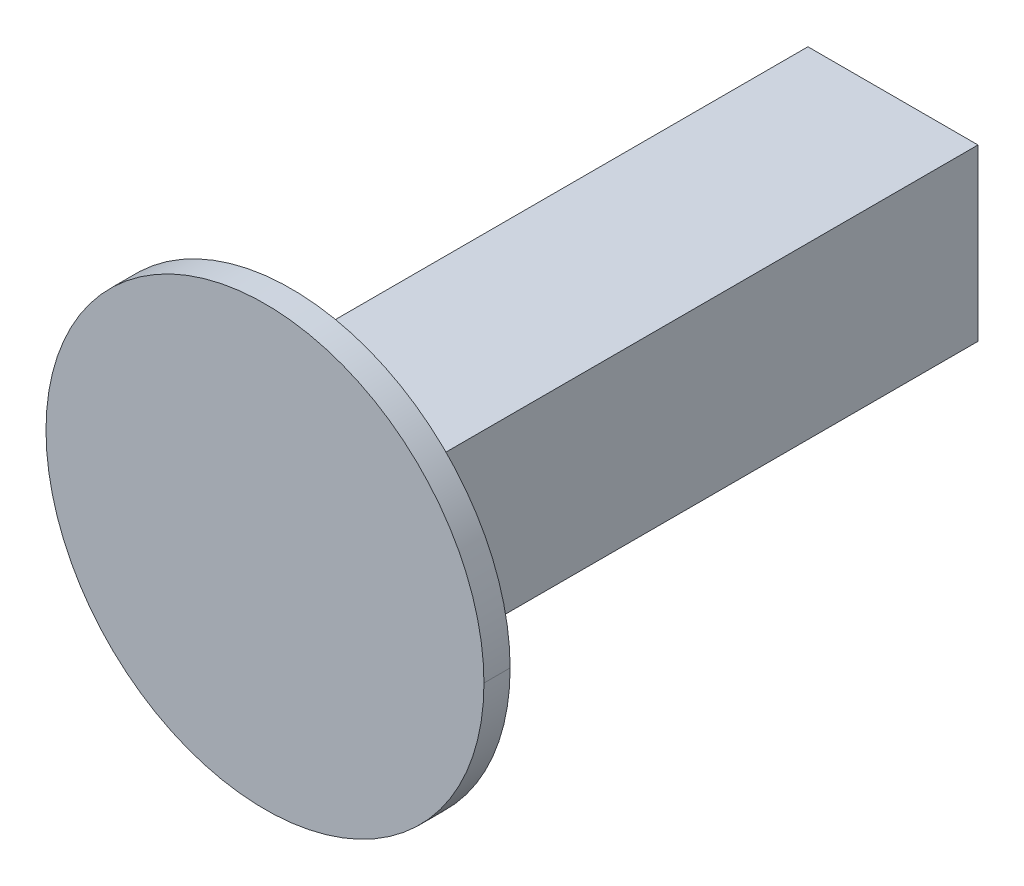
ISO-10303-21;
HEADER;
FILE_DESCRIPTION(('STEP AP214'),'2;1');
FILE_NAME('part.step','',(''),(''),'','','');
FILE_SCHEMA(('AUTOMOTIVE_DESIGN { 1 0 10303 214 1 1 1 1 }'));
ENDSEC;
DATA;
#1=APPLICATION_CONTEXT('core data for automotive mechanical design processes');
#2=APPLICATION_PROTOCOL_DEFINITION('international standard','automotive_design',2000,#1);
#3=PRODUCT_CONTEXT('',#1,'mechanical');
#4=PRODUCT('Part','Part','',(#3));
#5=PRODUCT_RELATED_PRODUCT_CATEGORY('part','',(#4));
#6=PRODUCT_DEFINITION_FORMATION('','',#4);
#7=PRODUCT_DEFINITION_CONTEXT('part definition',#1,'design');
#8=PRODUCT_DEFINITION('design','',#6,#7);
#9=PRODUCT_DEFINITION_SHAPE('','',#8);
#10=(LENGTH_UNIT() NAMED_UNIT(*) SI_UNIT(.MILLI.,.METRE.));
#11=(NAMED_UNIT(*) PLANE_ANGLE_UNIT() SI_UNIT($,.RADIAN.));
#12=(NAMED_UNIT(*) SI_UNIT($,.STERADIAN.) SOLID_ANGLE_UNIT());
#13=UNCERTAINTY_MEASURE_WITH_UNIT(LENGTH_MEASURE(1.E-05),#10,'distance_accuracy_value','');
#14=(GEOMETRIC_REPRESENTATION_CONTEXT(3) GLOBAL_UNCERTAINTY_ASSIGNED_CONTEXT((#13)) GLOBAL_UNIT_ASSIGNED_CONTEXT((#10,
#11,#12)) REPRESENTATION_CONTEXT('',''));
#15=CARTESIAN_POINT('',(0.,0.,0.));
#16=DIRECTION('',(0.,0.,1.));
#17=DIRECTION('',(1.,0.,0.));
#18=AXIS2_PLACEMENT_3D('',#15,#16,#17);
#19=CARTESIAN_POINT('',(3.63240747260726,-15.8073131525604,15.7803044688322));
#20=DIRECTION('',(-0.707106826087826,0.,-0.707106736285266));
#21=DIRECTION('',(-0.707106736285266,0.,0.707106826087826));
#22=AXIS2_PLACEMENT_3D('',#19,#20,#21);
#23=PLANE('',#22);
#24=DIRECTION('',(0.577350226437847,0.577350290565514,-0.577350290565514));
#25=VECTOR('',#24,1.);
#26=CARTESIAN_POINT('',(3.43240749160725,-15.8034131584001,15.9803044732719));
#27=LINE('',#26,#25);
#28=CARTESIAN_POINT('',(3.43240749136221,-15.8034131584566,15.9803044752322));
#29=VERTEX_POINT('',#28);
#30=CARTESIAN_POINT('',(3.63240747260726,-15.6034131551855,15.7803044694448));
#31=VERTEX_POINT('',#30);
#32=EDGE_CURVE('E28',#29,#31,#27,.T.);
#33=ORIENTED_EDGE('',*,*,#32,.F.);
#34=DIRECTION('',(0.,1.,0.));
#35=VECTOR('',#34,1.);
#36=CARTESIAN_POINT('',(3.43240749160725,-15.8034131603604,15.9803044752322));
#37=LINE('',#36,#35);
#38=CARTESIAN_POINT('',(3.432407491579,-15.153413168146,15.9803044749872));
#39=VERTEX_POINT('',#38);
#40=EDGE_CURVE('E11',#29,#39,#37,.T.);
#41=ORIENTED_EDGE('',*,*,#40,.T.);
#42=DIRECTION('',(-0.577350226437845,0.577350290565517,0.577350290565512));
#43=VECTOR('',#42,1.);
#44=CARTESIAN_POINT('',(3.63240747260726,-15.3534131701352,15.7803044700574));
#45=LINE('',#44,#43);
#46=CARTESIAN_POINT('',(3.63240747291355,-15.3534131695226,15.7803044688322));
#47=VERTEX_POINT('',#46);
#48=EDGE_CURVE('E161',#47,#39,#45,.T.);
#49=ORIENTED_EDGE('',*,*,#48,.F.);
#50=DIRECTION('',(0.,1.,0.));
#51=VECTOR('',#50,1.);
#52=CARTESIAN_POINT('',(3.63240747260726,-15.6034131539604,15.7803044688322));
#53=LINE('',#52,#51);
#54=EDGE_CURVE('E129',#31,#47,#53,.T.);
#55=ORIENTED_EDGE('',*,*,#54,.F.);
#56=EDGE_LOOP('',(#33,#41,#49,#55));
#57=FACE_BOUND('',#56,.T.);
#58=ADVANCED_FACE('F17',(#57),#23,.T.);
#59=CARTESIAN_POINT('',(3.43240749160725,-15.8034131603604,18.2803044726322));
#60=DIRECTION('',(1.,0.,0.));
#61=DIRECTION('',(0.,1.,0.));
#62=AXIS2_PLACEMENT_3D('',#59,#60,#61);
#63=PLANE('',#62);
#64=DIRECTION('',(0.,0.,1.));
#65=VECTOR('',#64,1.);
#66=CARTESIAN_POINT('',(3.43240749160725,-15.8034131603604,18.2803044726322));
#67=LINE('',#66,#65);
#68=CARTESIAN_POINT('',(3.43240749155074,-15.80341316053,18.2803044726322));
#69=VERTEX_POINT('',#68);
#70=EDGE_CURVE('E95',#29,#69,#67,.T.);
#71=ORIENTED_EDGE('',*,*,#70,.T.);
#72=DIRECTION('',(0.,-1.,0.));
#73=VECTOR('',#72,1.);
#74=CARTESIAN_POINT('',(3.43240749160725,-15.8034131603604,18.2803044726322));
#75=LINE('',#74,#73);
#76=CARTESIAN_POINT('',(3.43240749143771,-15.1534131657145,18.2803044726322));
#77=VERTEX_POINT('',#76);
#78=EDGE_CURVE('E215',#77,#69,#75,.T.);
#79=ORIENTED_EDGE('',*,*,#78,.F.);
#80=DIRECTION('',(0.,0.,-1.));
#81=VECTOR('',#80,1.);
#82=CARTESIAN_POINT('',(3.43240749138119,-15.1534131649604,15.9803044752322));
#83=LINE('',#82,#81);
#84=EDGE_CURVE('E125',#77,#39,#83,.T.);
#85=ORIENTED_EDGE('',*,*,#84,.T.);
#86=ORIENTED_EDGE('',*,*,#40,.F.);
#87=EDGE_LOOP('',(#71,#79,#85,#86));
#88=FACE_BOUND('',#87,.T.);
#89=ADVANCED_FACE('F123',(#88),#63,.F.);
#90=CARTESIAN_POINT('',(4.08630747920726,-15.6034131539604,15.7803044688322));
#91=DIRECTION('',(0.,-0.707106781186548,-0.707106781186548));
#92=DIRECTION('',(0.,-0.707106781186548,0.707106781186548));
#93=AXIS2_PLACEMENT_3D('',#90,#91,#92);
#94=PLANE('',#93);
#95=DIRECTION('',(-0.577350267982151,0.577350271604574,-0.577350267982153));
#96=VECTOR('',#95,1.);
#97=CARTESIAN_POINT('',(4.08240748500925,-15.8034131603604,15.9803044732342));
#98=LINE('',#97,#96);
#99=CARTESIAN_POINT('',(4.08240748487253,-15.8034131603604,15.9803044749825));
#100=VERTEX_POINT('',#99);
#101=CARTESIAN_POINT('',(3.8824074799193,-15.603413154573,15.780304469259));
#102=VERTEX_POINT('',#101);
#103=EDGE_CURVE('E135',#100,#102,#98,.T.);
#104=ORIENTED_EDGE('',*,*,#103,.F.);
#105=DIRECTION('',(-1.,0.,0.));
#106=VECTOR('',#105,1.);
#107=CARTESIAN_POINT('',(4.08240748700726,-15.8034131603604,15.9803044752322));
#108=LINE('',#107,#106);
#109=EDGE_CURVE('E77',#100,#29,#108,.T.);
#110=ORIENTED_EDGE('',*,*,#109,.T.);
#111=ORIENTED_EDGE('',*,*,#32,.T.);
#112=DIRECTION('',(-1.,0.,0.));
#113=VECTOR('',#112,1.);
#114=CARTESIAN_POINT('',(3.88240748060726,-15.6034131539604,15.7803044688322));
#115=LINE('',#114,#113);
#116=EDGE_CURVE('E159',#102,#31,#115,.T.);
#117=ORIENTED_EDGE('',*,*,#116,.F.);
#118=EDGE_LOOP('',(#104,#110,#111,#117));
#119=FACE_BOUND('',#118,.T.);
#120=ADVANCED_FACE('F133',(#119),#94,.T.);
#121=CARTESIAN_POINT('',(3.88240748060726,-15.6034131539604,15.7803044688322));
#122=DIRECTION('',(0.,0.,-1.));
#123=DIRECTION('',(0.,-1.,0.));
#124=AXIS2_PLACEMENT_3D('',#121,#122,#123);
#125=PLANE('',#124);
#126=ORIENTED_EDGE('',*,*,#116,.T.);
#127=ORIENTED_EDGE('',*,*,#54,.T.);
#128=DIRECTION('',(-1.,0.,0.));
#129=VECTOR('',#128,1.);
#130=CARTESIAN_POINT('',(4.08630747920726,-15.3534131713604,15.7803044688322));
#131=LINE('',#130,#129);
#132=CARTESIAN_POINT('',(3.88240747930672,-15.3534131701352,15.7803044686465));
#133=VERTEX_POINT('',#132);
#134=EDGE_CURVE('E62',#133,#47,#131,.T.);
#135=ORIENTED_EDGE('',*,*,#134,.F.);
#136=DIRECTION('',(0.,1.,0.));
#137=VECTOR('',#136,1.);
#138=CARTESIAN_POINT('',(3.88240747986409,-15.8073131525604,15.780304468089));
#139=LINE('',#138,#137);
#140=EDGE_CURVE('E164',#102,#133,#139,.T.);
#141=ORIENTED_EDGE('',*,*,#140,.F.);
#142=EDGE_LOOP('',(#126,#127,#135,#141));
#143=FACE_BOUND('',#142,.T.);
#144=ADVANCED_FACE('F238',(#143),#125,.T.);
#145=CARTESIAN_POINT('',(4.08630747920726,-15.1534131649604,15.9803044752322));
#146=DIRECTION('',(0.,0.707106781186547,-0.707106781186548));
#147=DIRECTION('',(-1.,0.,0.));
#148=AXIS2_PLACEMENT_3D('',#145,#146,#147);
#149=PLANE('',#148);
#150=DIRECTION('',(0.577350267982151,0.577350271604574,0.577350267982153));
#151=VECTOR('',#150,1.);
#152=CARTESIAN_POINT('',(3.88240747986409,-15.3534131713604,15.780304468089));
#153=LINE('',#152,#151);
#154=CARTESIAN_POINT('',(4.08240748278032,-15.1534131658841,15.9803044740023));
#155=VERTEX_POINT('',#154);
#156=EDGE_CURVE('E165',#133,#155,#153,.T.);
#157=ORIENTED_EDGE('',*,*,#156,.F.);
#158=ORIENTED_EDGE('',*,*,#134,.T.);
#159=ORIENTED_EDGE('',*,*,#48,.T.);
#160=DIRECTION('',(1.,0.,0.));
#161=VECTOR('',#160,1.);
#162=CARTESIAN_POINT('',(4.08240748700726,-15.1534131649604,15.9803044752322));
#163=LINE('',#162,#161);
#164=EDGE_CURVE('E21',#39,#155,#163,.T.);
#165=ORIENTED_EDGE('',*,*,#164,.T.);
#166=EDGE_LOOP('',(#157,#158,#159,#165));
#167=FACE_BOUND('',#166,.T.);
#168=ADVANCED_FACE('F19',(#167),#149,.T.);
#169=CARTESIAN_POINT('',(4.08240748700726,-15.8034131603604,18.2803044726322));
#170=DIRECTION('',(0.,1.,0.));
#171=DIRECTION('',(1.,0.,0.));
#172=AXIS2_PLACEMENT_3D('',#169,#170,#171);
#173=PLANE('',#172);
#174=DIRECTION('',(0.,0.,1.));
#175=VECTOR('',#174,1.);
#176=CARTESIAN_POINT('',(4.08240748700726,-15.8034131603604,15.9803044752322));
#177=LINE('',#176,#175);
#178=CARTESIAN_POINT('',(4.08240748734635,-15.803413160417,18.2803044726322));
#179=VERTEX_POINT('',#178);
#180=EDGE_CURVE('E154',#100,#179,#177,.T.);
#181=ORIENTED_EDGE('',*,*,#180,.T.);
#182=DIRECTION('',(1.,0.,0.));
#183=VECTOR('',#182,1.);
#184=CARTESIAN_POINT('',(4.08240748700726,-15.8034131603604,18.2803044726322));
#185=LINE('',#184,#183);
#186=EDGE_CURVE('E142',#69,#179,#185,.T.);
#187=ORIENTED_EDGE('',*,*,#186,.F.);
#188=ORIENTED_EDGE('',*,*,#70,.F.);
#189=ORIENTED_EDGE('',*,*,#109,.F.);
#190=EDGE_LOOP('',(#181,#187,#188,#189));
#191=FACE_BOUND('',#190,.T.);
#192=ADVANCED_FACE('F140',(#191),#173,.F.);
#193=CARTESIAN_POINT('',(4.08240748700726,-15.1534131649604,15.9803044752322));
#194=DIRECTION('',(0.,-1.,0.));
#195=DIRECTION('',(0.,0.,-1.));
#196=AXIS2_PLACEMENT_3D('',#193,#194,#195);
#197=PLANE('',#196);
#198=ORIENTED_EDGE('',*,*,#84,.F.);
#199=DIRECTION('',(-1.,0.,0.));
#200=VECTOR('',#199,1.);
#201=CARTESIAN_POINT('',(4.08240748700726,-15.1534131649604,18.2803044726322));
#202=LINE('',#201,#200);
#203=CARTESIAN_POINT('',(4.08240748512228,-15.1534131647344,18.2803044726322));
#204=VERTEX_POINT('',#203);
#205=EDGE_CURVE('E212',#204,#77,#202,.T.);
#206=ORIENTED_EDGE('',*,*,#205,.F.);
#207=DIRECTION('',(0.,0.,-1.));
#208=VECTOR('',#207,1.);
#209=CARTESIAN_POINT('',(4.08240748700726,-15.1534131645083,15.9803044752322));
#210=LINE('',#209,#208);
#211=EDGE_CURVE('E157',#204,#155,#210,.T.);
#212=ORIENTED_EDGE('',*,*,#211,.T.);
#213=ORIENTED_EDGE('',*,*,#164,.F.);
#214=EDGE_LOOP('',(#198,#206,#212,#213));
#215=FACE_BOUND('',#214,.T.);
#216=ADVANCED_FACE('F235',(#215),#197,.F.);
#217=CARTESIAN_POINT('',(4.08240748700726,-15.8073131525604,15.9803044752322));
#218=DIRECTION('',(0.707106781186546,0.,-0.707106781186549));
#219=DIRECTION('',(0.,-1.,0.));
#220=AXIS2_PLACEMENT_3D('',#217,#218,#219);
#221=PLANE('',#220);
#222=ORIENTED_EDGE('',*,*,#156,.T.);
#223=DIRECTION('',(0.,-1.,0.));
#224=VECTOR('',#223,1.);
#225=CARTESIAN_POINT('',(4.08240748700726,-15.8034131603604,15.9803044752322));
#226=LINE('',#225,#224);
#227=EDGE_CURVE('E156',#155,#100,#226,.T.);
#228=ORIENTED_EDGE('',*,*,#227,.T.);
#229=ORIENTED_EDGE('',*,*,#103,.T.);
#230=ORIENTED_EDGE('',*,*,#140,.T.);
#231=EDGE_LOOP('',(#222,#228,#229,#230));
#232=FACE_BOUND('',#231,.T.);
#233=ADVANCED_FACE('F257',(#232),#221,.T.);
#234=CARTESIAN_POINT('',(4.08240748700726,-15.8034131603604,15.9803044752322));
#235=DIRECTION('',(-1.,0.,0.));
#236=DIRECTION('',(0.,0.,1.));
#237=AXIS2_PLACEMENT_3D('',#234,#235,#236);
#238=PLANE('',#237);
#239=ORIENTED_EDGE('',*,*,#211,.F.);
#240=DIRECTION('',(0.,1.,0.));
#241=VECTOR('',#240,1.);
#242=CARTESIAN_POINT('',(4.08240748745938,-16.3253431807604,18.2803044726322));
#243=LINE('',#242,#241);
#244=EDGE_CURVE('E152',#179,#204,#243,.T.);
#245=ORIENTED_EDGE('',*,*,#244,.F.);
#246=ORIENTED_EDGE('',*,*,#180,.F.);
#247=ORIENTED_EDGE('',*,*,#227,.F.);
#248=EDGE_LOOP('',(#239,#245,#246,#247));
#249=FACE_BOUND('',#248,.T.);
#250=ADVANCED_FACE('F254',(#249),#238,.F.);
#251=CARTESIAN_POINT('',(4.60433750740725,-16.3253431807604,18.2803044726322));
#252=DIRECTION('',(0.,0.,-1.));
#253=DIRECTION('',(0.,-1.,0.));
#254=AXIS2_PLACEMENT_3D('',#251,#252,#253);
#255=PLANE('',#254);
#256=ORIENTED_EDGE('',*,*,#186,.T.);
#257=ORIENTED_EDGE('',*,*,#244,.T.);
#258=ORIENTED_EDGE('',*,*,#205,.T.);
#259=ORIENTED_EDGE('',*,*,#78,.T.);
#260=EDGE_LOOP('',(#256,#257,#258,#259));
#261=FACE_BOUND('',#260,.T.);
#262=CARTESIAN_POINT('',(3.75740747660726,-15.4784131753604,18.2803044726322));
#263=DIRECTION('',(0.,0.,1.));
#264=DIRECTION('',(1.,0.,0.));
#265=AXIS2_PLACEMENT_3D('',#262,#263,#264);
#266=CIRCLE('',#265,0.836887378800002);
#267=CARTESIAN_POINT('',(4.59429485540726,-15.4784131753604,18.2803044726322));
#268=VERTEX_POINT('',#267);
#269=CARTESIAN_POINT('',(2.92052009780725,-15.4784131753604,18.2803044726322));
#270=VERTEX_POINT('',#269);
#271=EDGE_CURVE('E198',#268,#270,#266,.T.);
#272=ORIENTED_EDGE('',*,*,#271,.F.);
#273=CARTESIAN_POINT('',(3.75740747660726,-15.4784131753604,18.2803044726322));
#274=DIRECTION('',(0.,0.,1.));
#275=DIRECTION('',(1.,0.,0.));
#276=AXIS2_PLACEMENT_3D('',#273,#274,#275);
#277=CIRCLE('',#276,0.836887378800002);
#278=EDGE_CURVE('E209',#270,#268,#277,.T.);
#279=ORIENTED_EDGE('',*,*,#278,.F.);
#280=EDGE_LOOP('',(#272,#279));
#281=FACE_BOUND('',#280,.T.);
#282=ADVANCED_FACE('F227',(#261,#281),#255,.T.);
#283=CARTESIAN_POINT('',(3.75740747660726,-15.4784131753604,18.2803044726322));
#284=DIRECTION('',(0.,0.,1.));
#285=DIRECTION('',(1.,0.,0.));
#286=AXIS2_PLACEMENT_3D('',#283,#284,#285);
#287=CYLINDRICAL_SURFACE('',#286,0.836887378800002);
#288=DIRECTION('',(0.,0.,1.));
#289=VECTOR('',#288,1.);
#290=CARTESIAN_POINT('',(2.92052009780725,-15.4784131753604,18.2803044726322));
#291=LINE('',#290,#289);
#292=CARTESIAN_POINT('',(2.92052009780725,-15.4784131753604,18.3803044758322));
#293=VERTEX_POINT('',#292);
#294=EDGE_CURVE('E189',#270,#293,#291,.T.);
#295=ORIENTED_EDGE('',*,*,#294,.F.);
#296=ORIENTED_EDGE('',*,*,#278,.T.);
#297=DIRECTION('',(0.,0.,1.));
#298=VECTOR('',#297,1.);
#299=CARTESIAN_POINT('',(4.59429485540726,-15.4784131753604,18.2803044726322));
#300=LINE('',#299,#298);
#301=CARTESIAN_POINT('',(4.59429485540726,-15.4784131753604,18.3803044758322));
#302=VERTEX_POINT('',#301);
#303=EDGE_CURVE('E188',#268,#302,#300,.T.);
#304=ORIENTED_EDGE('',*,*,#303,.T.);
#305=CARTESIAN_POINT('',(3.75740747660726,-15.4784131753604,18.3803044758322));
#306=DIRECTION('',(0.,0.,-1.));
#307=DIRECTION('',(1.,0.,0.));
#308=AXIS2_PLACEMENT_3D('',#305,#306,#307);
#309=CIRCLE('',#308,0.836887378800002);
#310=EDGE_CURVE('E108',#302,#293,#309,.T.);
#311=ORIENTED_EDGE('',*,*,#310,.T.);
#312=EDGE_LOOP('',(#295,#296,#304,#311));
#313=FACE_BOUND('',#312,.T.);
#314=ADVANCED_FACE('F258',(#313),#287,.T.);
#315=CARTESIAN_POINT('',(4.60433750740725,-16.3253431807604,18.3803044758322));
#316=DIRECTION('',(0.,0.,-1.));
#317=DIRECTION('',(0.,-1.,0.));
#318=AXIS2_PLACEMENT_3D('',#315,#316,#317);
#319=PLANE('',#318);
#320=ORIENTED_EDGE('',*,*,#310,.F.);
#321=CARTESIAN_POINT('',(3.75740747660726,-15.4784131753604,18.3803044758322));
#322=DIRECTION('',(0.,0.,-1.));
#323=DIRECTION('',(1.,0.,0.));
#324=AXIS2_PLACEMENT_3D('',#321,#322,#323);
#325=CIRCLE('',#324,0.836887378800002);
#326=EDGE_CURVE('E185',#293,#302,#325,.T.);
#327=ORIENTED_EDGE('',*,*,#326,.F.);
#328=EDGE_LOOP('',(#320,#327));
#329=FACE_BOUND('',#328,.T.);
#330=ADVANCED_FACE('F260',(#329),#319,.F.);
#331=CARTESIAN_POINT('',(3.75740747660726,-15.4784131753604,18.2803044726322));
#332=DIRECTION('',(0.,0.,1.));
#333=DIRECTION('',(1.,0.,0.));
#334=AXIS2_PLACEMENT_3D('',#331,#332,#333);
#335=CYLINDRICAL_SURFACE('',#334,0.836887378800002);
#336=ORIENTED_EDGE('',*,*,#271,.T.);
#337=ORIENTED_EDGE('',*,*,#294,.T.);
#338=ORIENTED_EDGE('',*,*,#326,.T.);
#339=ORIENTED_EDGE('',*,*,#303,.F.);
#340=EDGE_LOOP('',(#336,#337,#338,#339));
#341=FACE_BOUND('',#340,.T.);
#342=ADVANCED_FACE('F266',(#341),#335,.T.);
#343=CLOSED_SHELL('',(#58,#89,#120,#144,#168,#192,#216,#233,#250,#282,#314,#330,#342));
#344=MANIFOLD_SOLID_BREP('B1',#343);
#345=ADVANCED_BREP_SHAPE_REPRESENTATION('',(#18,#344),#14);
#346=SHAPE_DEFINITION_REPRESENTATION(#9,#345);
ENDSEC;
END-ISO-10303-21;
